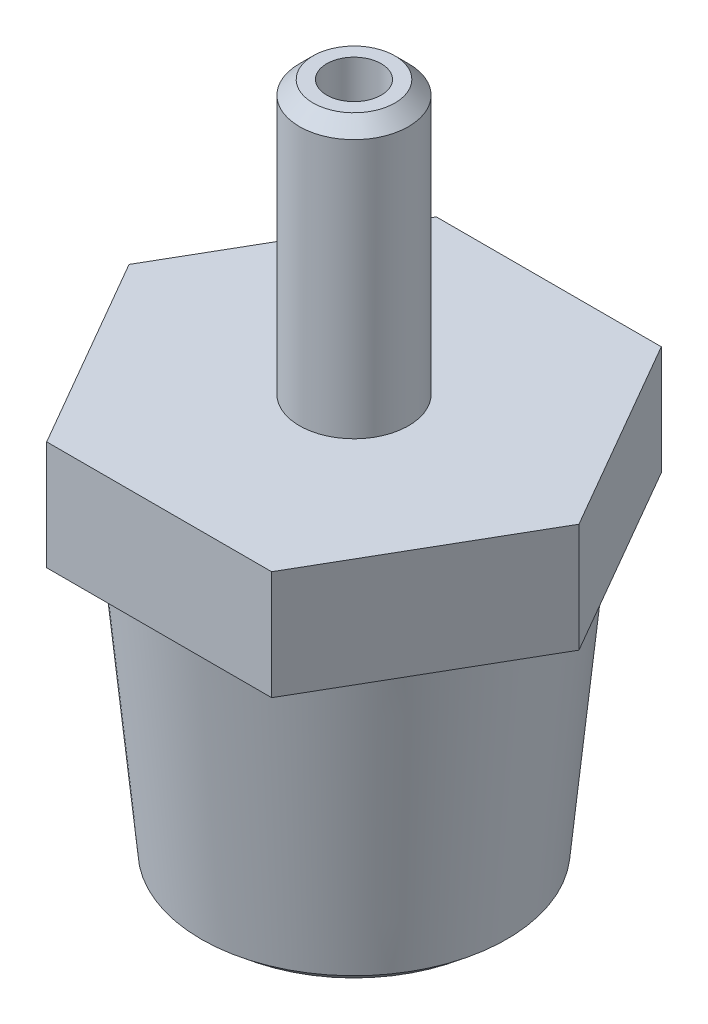
ISO-10303-21;
HEADER;
FILE_DESCRIPTION(('STEP AP214'),'2;1');
FILE_NAME('part.step','',(''),(''),'','','');
FILE_SCHEMA(('AUTOMOTIVE_DESIGN { 1 0 10303 214 1 1 1 1 }'));
ENDSEC;
DATA;
#1=APPLICATION_CONTEXT('core data for automotive mechanical design processes');
#2=APPLICATION_PROTOCOL_DEFINITION('international standard','automotive_design',2000,#1);
#3=PRODUCT_CONTEXT('',#1,'mechanical');
#4=PRODUCT('Part','Part','',(#3));
#5=PRODUCT_RELATED_PRODUCT_CATEGORY('part','',(#4));
#6=PRODUCT_DEFINITION_FORMATION('','',#4);
#7=PRODUCT_DEFINITION_CONTEXT('part definition',#1,'design');
#8=PRODUCT_DEFINITION('design','',#6,#7);
#9=PRODUCT_DEFINITION_SHAPE('','',#8);
#10=(LENGTH_UNIT() NAMED_UNIT(*) SI_UNIT(.MILLI.,.METRE.));
#11=(NAMED_UNIT(*) PLANE_ANGLE_UNIT() SI_UNIT($,.RADIAN.));
#12=(NAMED_UNIT(*) SI_UNIT($,.STERADIAN.) SOLID_ANGLE_UNIT());
#13=UNCERTAINTY_MEASURE_WITH_UNIT(LENGTH_MEASURE(1.E-05),#10,'distance_accuracy_value','');
#14=(GEOMETRIC_REPRESENTATION_CONTEXT(3) GLOBAL_UNCERTAINTY_ASSIGNED_CONTEXT((#13)) GLOBAL_UNIT_ASSIGNED_CONTEXT((#10,
#11,#12)) REPRESENTATION_CONTEXT('',''));
#15=CARTESIAN_POINT('',(0.,0.,0.));
#16=DIRECTION('',(0.,0.,1.));
#17=DIRECTION('',(1.,0.,0.));
#18=AXIS2_PLACEMENT_3D('',#15,#16,#17);
#19=CARTESIAN_POINT('',(0.,0.,0.));
#20=DIRECTION('',(0.,-1.,0.));
#21=DIRECTION('',(0.,0.,-1.));
#22=AXIS2_PLACEMENT_3D('',#19,#20,#21);
#23=CYLINDRICAL_SURFACE('',#22,1.);
#24=CARTESIAN_POINT('',(0.,25.,0.));
#25=DIRECTION('',(0.,-1.,0.));
#26=DIRECTION('',(0.,0.,-1.));
#27=AXIS2_PLACEMENT_3D('',#24,#25,#26);
#28=CIRCLE('',#27,1.);
#29=CARTESIAN_POINT('',(0.,25.,-1.));
#30=VERTEX_POINT('',#29);
#31=EDGE_CURVE('E158',#30,#30,#28,.T.);
#32=ORIENTED_EDGE('',*,*,#31,.F.);
#33=EDGE_LOOP('',(#32));
#34=FACE_BOUND('',#33,.T.);
#35=CARTESIAN_POINT('',(0.,11.,0.));
#36=DIRECTION('',(0.,1.,0.));
#37=DIRECTION('',(0.,0.,1.));
#38=AXIS2_PLACEMENT_3D('',#35,#36,#37);
#39=CIRCLE('',#38,1.);
#40=CARTESIAN_POINT('',(0.,11.,1.));
#41=VERTEX_POINT('',#40);
#42=EDGE_CURVE('E129',#41,#41,#39,.T.);
#43=ORIENTED_EDGE('',*,*,#42,.F.);
#44=EDGE_LOOP('',(#43));
#45=FACE_BOUND('',#44,.T.);
#46=ADVANCED_FACE('F35',(#34,#45),#23,.F.);
#47=CARTESIAN_POINT('',(1.,25.,0.));
#48=DIRECTION('',(0.,1.,0.));
#49=DIRECTION('',(0.,0.,1.));
#50=AXIS2_PLACEMENT_3D('',#47,#48,#49);
#51=PLANE('',#50);
#52=CARTESIAN_POINT('',(0.,25.,0.));
#53=DIRECTION('',(0.,1.,0.));
#54=DIRECTION('',(0.,0.,1.));
#55=AXIS2_PLACEMENT_3D('',#52,#53,#54);
#56=CIRCLE('',#55,1.49999999999999);
#57=CARTESIAN_POINT('',(0.,25.,1.49999999999999));
#58=VERTEX_POINT('',#57);
#59=EDGE_CURVE('E11',#58,#58,#56,.T.);
#60=ORIENTED_EDGE('',*,*,#59,.T.);
#61=EDGE_LOOP('',(#60));
#62=FACE_BOUND('',#61,.T.);
#63=ORIENTED_EDGE('',*,*,#31,.T.);
#64=EDGE_LOOP('',(#63));
#65=FACE_BOUND('',#64,.T.);
#66=ADVANCED_FACE('F184',(#62,#65),#51,.T.);
#67=CARTESIAN_POINT('',(0.,0.,0.));
#68=DIRECTION('',(0.,-1.,0.));
#69=DIRECTION('',(0.,0.,-1.));
#70=AXIS2_PLACEMENT_3D('',#67,#68,#69);
#71=CYLINDRICAL_SURFACE('',#70,2.);
#72=CARTESIAN_POINT('',(0.,24.5,0.));
#73=DIRECTION('',(0.,1.,0.));
#74=DIRECTION('',(0.,0.,1.));
#75=AXIS2_PLACEMENT_3D('',#72,#73,#74);
#76=CIRCLE('',#75,2.);
#77=CARTESIAN_POINT('',(0.,24.5,2.));
#78=VERTEX_POINT('',#77);
#79=EDGE_CURVE('E45',#78,#78,#76,.F.);
#80=ORIENTED_EDGE('',*,*,#79,.T.);
#81=EDGE_LOOP('',(#80));
#82=FACE_BOUND('',#81,.T.);
#83=CARTESIAN_POINT('',(0.,15.,0.));
#84=DIRECTION('',(0.,-1.,0.));
#85=DIRECTION('',(0.,0.,-1.));
#86=AXIS2_PLACEMENT_3D('',#83,#84,#85);
#87=CIRCLE('',#86,2.);
#88=CARTESIAN_POINT('',(0.,15.,-2.));
#89=VERTEX_POINT('',#88);
#90=EDGE_CURVE('E155',#89,#89,#87,.T.);
#91=ORIENTED_EDGE('',*,*,#90,.F.);
#92=EDGE_LOOP('',(#91));
#93=FACE_BOUND('',#92,.T.);
#94=ADVANCED_FACE('F171',(#82,#93),#71,.T.);
#95=CARTESIAN_POINT('',(2.,15.,0.));
#96=DIRECTION('',(0.,1.,0.));
#97=DIRECTION('',(0.,0.,1.));
#98=AXIS2_PLACEMENT_3D('',#95,#96,#97);
#99=PLANE('',#98);
#100=ORIENTED_EDGE('',*,*,#90,.T.);
#101=EDGE_LOOP('',(#100));
#102=FACE_BOUND('',#101,.T.);
#103=DIRECTION('',(-0.5,0.,0.866025403784439));
#104=VECTOR('',#103,1.);
#105=CARTESIAN_POINT('',(-4.12444598552339,15.,-7.14375));
#106=LINE('',#105,#104);
#107=CARTESIAN_POINT('',(-4.12444598552339,15.,-7.14375));
#108=VERTEX_POINT('',#107);
#109=CARTESIAN_POINT('',(-8.24889197104678,15.,0.));
#110=VERTEX_POINT('',#109);
#111=EDGE_CURVE('E125',#108,#110,#106,.T.);
#112=ORIENTED_EDGE('',*,*,#111,.T.);
#113=DIRECTION('',(0.5,0.,0.866025403784439));
#114=VECTOR('',#113,1.);
#115=CARTESIAN_POINT('',(-8.24889197104678,15.,0.));
#116=LINE('',#115,#114);
#117=CARTESIAN_POINT('',(-4.12444598552339,15.,7.14375));
#118=VERTEX_POINT('',#117);
#119=EDGE_CURVE('E128',#110,#118,#116,.T.);
#120=ORIENTED_EDGE('',*,*,#119,.T.);
#121=DIRECTION('',(1.,0.,0.));
#122=VECTOR('',#121,1.);
#123=CARTESIAN_POINT('',(-4.12444598552339,15.,7.14375));
#124=LINE('',#123,#122);
#125=CARTESIAN_POINT('',(4.12444598552339,15.,7.14375));
#126=VERTEX_POINT('',#125);
#127=EDGE_CURVE('E132',#118,#126,#124,.T.);
#128=ORIENTED_EDGE('',*,*,#127,.T.);
#129=DIRECTION('',(0.5,0.,-0.866025403784439));
#130=VECTOR('',#129,1.);
#131=CARTESIAN_POINT('',(4.12444598552339,15.,7.14375));
#132=LINE('',#131,#130);
#133=CARTESIAN_POINT('',(8.24889197104678,15.,0.));
#134=VERTEX_POINT('',#133);
#135=EDGE_CURVE('E135',#126,#134,#132,.T.);
#136=ORIENTED_EDGE('',*,*,#135,.T.);
#137=DIRECTION('',(-0.5,0.,-0.866025403784439));
#138=VECTOR('',#137,1.);
#139=CARTESIAN_POINT('',(8.24889197104678,15.,0.));
#140=LINE('',#139,#138);
#141=CARTESIAN_POINT('',(4.12444598552339,15.,-7.14375));
#142=VERTEX_POINT('',#141);
#143=EDGE_CURVE('E101',#134,#142,#140,.T.);
#144=ORIENTED_EDGE('',*,*,#143,.T.);
#145=DIRECTION('',(-1.,0.,0.));
#146=VECTOR('',#145,1.);
#147=CARTESIAN_POINT('',(4.12444598552339,15.,-7.14375));
#148=LINE('',#147,#146);
#149=EDGE_CURVE('E138',#142,#108,#148,.T.);
#150=ORIENTED_EDGE('',*,*,#149,.T.);
#151=EDGE_LOOP('',(#112,#120,#128,#136,#144,#150));
#152=FACE_BOUND('',#151,.T.);
#153=ADVANCED_FACE('F202',(#102,#152),#99,.T.);
#154=CARTESIAN_POINT('',(0.,11.,0.));
#155=DIRECTION('',(0.,1.,0.));
#156=DIRECTION('',(0.,0.,1.));
#157=AXIS2_PLACEMENT_3D('',#154,#155,#156);
#158=PLANE('',#157);
#159=ORIENTED_EDGE('',*,*,#42,.T.);
#160=EDGE_LOOP('',(#159));
#161=FACE_BOUND('',#160,.T.);
#162=CARTESIAN_POINT('',(0.,11.,0.));
#163=DIRECTION('',(0.,1.,0.));
#164=DIRECTION('',(0.,0.,1.));
#165=AXIS2_PLACEMENT_3D('',#162,#163,#164);
#166=CIRCLE('',#165,3.55625);
#167=CARTESIAN_POINT('',(0.,11.,3.55625));
#168=VERTEX_POINT('',#167);
#169=EDGE_CURVE('E143',#168,#168,#166,.T.);
#170=ORIENTED_EDGE('',*,*,#169,.F.);
#171=EDGE_LOOP('',(#170));
#172=FACE_BOUND('',#171,.T.);
#173=ADVANCED_FACE('F205',(#161,#172),#158,.F.);
#174=CARTESIAN_POINT('',(0.,0.,0.));
#175=DIRECTION('',(0.,1.,0.));
#176=DIRECTION('',(0.,0.,1.));
#177=AXIS2_PLACEMENT_3D('',#174,#175,#176);
#178=CONICAL_SURFACE('',#177,5.55625,0.0959544192307205);
#179=CARTESIAN_POINT('',(0.,0.497699952929385,0.));
#180=DIRECTION('',(0.,-1.,0.));
#181=DIRECTION('',(0.,0.,-1.));
#182=AXIS2_PLACEMENT_3D('',#179,#180,#181);
#183=CIRCLE('',#182,5.60415362046945);
#184=CARTESIAN_POINT('',(0.,0.497699952929385,-5.60415362046945));
#185=VERTEX_POINT('',#184);
#186=EDGE_CURVE('E166',#185,#185,#183,.F.);
#187=ORIENTED_EDGE('',*,*,#186,.T.);
#188=EDGE_LOOP('',(#187));
#189=FACE_BOUND('',#188,.T.);
#190=CARTESIAN_POINT('',(0.,11.,0.));
#191=DIRECTION('',(0.,1.,0.));
#192=DIRECTION('',(0.,0.,1.));
#193=AXIS2_PLACEMENT_3D('',#190,#191,#192);
#194=CIRCLE('',#193,6.615);
#195=CARTESIAN_POINT('',(0.,11.,6.615));
#196=VERTEX_POINT('',#195);
#197=EDGE_CURVE('E149',#196,#196,#194,.F.);
#198=ORIENTED_EDGE('',*,*,#197,.T.);
#199=EDGE_LOOP('',(#198));
#200=FACE_BOUND('',#199,.T.);
#201=ADVANCED_FACE('F207',(#189,#200),#178,.T.);
#202=CARTESIAN_POINT('',(5.55625,0.,0.));
#203=DIRECTION('',(0.,-1.,0.));
#204=DIRECTION('',(0.,0.,-1.));
#205=AXIS2_PLACEMENT_3D('',#202,#203,#204);
#206=PLANE('',#205);
#207=CARTESIAN_POINT('',(0.,0.,0.));
#208=DIRECTION('',(0.,-1.,0.));
#209=DIRECTION('',(0.,0.,-1.));
#210=AXIS2_PLACEMENT_3D('',#207,#208,#209);
#211=CIRCLE('',#210,5.00044288918443);
#212=CARTESIAN_POINT('',(0.,0.,-5.00044288918443));
#213=VERTEX_POINT('',#212);
#214=EDGE_CURVE('E161',#213,#213,#211,.T.);
#215=ORIENTED_EDGE('',*,*,#214,.T.);
#216=EDGE_LOOP('',(#215));
#217=FACE_BOUND('',#216,.T.);
#218=CARTESIAN_POINT('',(0.,0.,0.));
#219=DIRECTION('',(0.,-1.,0.));
#220=DIRECTION('',(0.,0.,-1.));
#221=AXIS2_PLACEMENT_3D('',#218,#219,#220);
#222=CIRCLE('',#221,3.55625);
#223=CARTESIAN_POINT('',(0.,0.,-3.55625));
#224=VERTEX_POINT('',#223);
#225=EDGE_CURVE('E152',#224,#224,#222,.T.);
#226=ORIENTED_EDGE('',*,*,#225,.F.);
#227=EDGE_LOOP('',(#226));
#228=FACE_BOUND('',#227,.T.);
#229=ADVANCED_FACE('F210',(#217,#228),#206,.T.);
#230=CARTESIAN_POINT('',(0.,0.,0.));
#231=DIRECTION('',(0.,-1.,0.));
#232=DIRECTION('',(0.,0.,-1.));
#233=AXIS2_PLACEMENT_3D('',#230,#231,#232);
#234=CYLINDRICAL_SURFACE('',#233,3.55625);
#235=ORIENTED_EDGE('',*,*,#225,.T.);
#236=EDGE_LOOP('',(#235));
#237=FACE_BOUND('',#236,.T.);
#238=ORIENTED_EDGE('',*,*,#169,.T.);
#239=EDGE_LOOP('',(#238));
#240=FACE_BOUND('',#239,.T.);
#241=ADVANCED_FACE('F214',(#237,#240),#234,.F.);
#242=DIRECTION('',(-0.5,0.,0.866025403784439));
#243=VECTOR('',#242,1.);
#244=CARTESIAN_POINT('',(-4.12444598552339,11.,-7.14375));
#245=LINE('',#244,#243);
#246=CARTESIAN_POINT('',(-4.12444598552339,11.,-7.14375));
#247=VERTEX_POINT('',#246);
#248=CARTESIAN_POINT('',(-8.24889197104678,11.,0.));
#249=VERTEX_POINT('',#248);
#250=EDGE_CURVE('E141',#247,#249,#245,.T.);
#251=ORIENTED_EDGE('',*,*,#250,.F.);
#252=DIRECTION('',(-1.,0.,0.));
#253=VECTOR('',#252,1.);
#254=CARTESIAN_POINT('',(4.12444598552339,11.,-7.14375));
#255=LINE('',#254,#253);
#256=CARTESIAN_POINT('',(4.12444598552339,11.,-7.14375));
#257=VERTEX_POINT('',#256);
#258=EDGE_CURVE('E115',#257,#247,#255,.T.);
#259=ORIENTED_EDGE('',*,*,#258,.F.);
#260=DIRECTION('',(-0.5,0.,-0.866025403784439));
#261=VECTOR('',#260,1.);
#262=CARTESIAN_POINT('',(8.24889197104678,11.,0.));
#263=LINE('',#262,#261);
#264=CARTESIAN_POINT('',(8.24889197104678,11.,0.));
#265=VERTEX_POINT('',#264);
#266=EDGE_CURVE('E99',#265,#257,#263,.T.);
#267=ORIENTED_EDGE('',*,*,#266,.F.);
#268=DIRECTION('',(0.5,0.,-0.866025403784439));
#269=VECTOR('',#268,1.);
#270=CARTESIAN_POINT('',(4.12444598552339,11.,7.14375));
#271=LINE('',#270,#269);
#272=CARTESIAN_POINT('',(4.12444598552339,11.,7.14375));
#273=VERTEX_POINT('',#272);
#274=EDGE_CURVE('E113',#273,#265,#271,.T.);
#275=ORIENTED_EDGE('',*,*,#274,.F.);
#276=DIRECTION('',(1.,0.,0.));
#277=VECTOR('',#276,1.);
#278=CARTESIAN_POINT('',(-4.12444598552339,11.,7.14375));
#279=LINE('',#278,#277);
#280=CARTESIAN_POINT('',(-4.12444598552339,11.,7.14375));
#281=VERTEX_POINT('',#280);
#282=EDGE_CURVE('E118',#281,#273,#279,.T.);
#283=ORIENTED_EDGE('',*,*,#282,.F.);
#284=DIRECTION('',(0.5,0.,0.866025403784439));
#285=VECTOR('',#284,1.);
#286=CARTESIAN_POINT('',(-8.24889197104678,11.,0.));
#287=LINE('',#286,#285);
#288=EDGE_CURVE('E120',#249,#281,#287,.T.);
#289=ORIENTED_EDGE('',*,*,#288,.F.);
#290=EDGE_LOOP('',(#251,#259,#267,#275,#283,#289));
#291=FACE_BOUND('',#290,.T.);
#292=ORIENTED_EDGE('',*,*,#197,.F.);
#293=EDGE_LOOP('',(#292));
#294=FACE_BOUND('',#293,.T.);
#295=ADVANCED_FACE('F110',(#291,#294),#158,.F.);
#296=CARTESIAN_POINT('',(-4.12444598552339,11.,-7.14375));
#297=DIRECTION('',(-0.866025403784439,0.,-0.5));
#298=DIRECTION('',(-0.5,0.,0.866025403784439));
#299=AXIS2_PLACEMENT_3D('',#296,#297,#298);
#300=PLANE('',#299);
#301=ORIENTED_EDGE('',*,*,#111,.F.);
#302=DIRECTION('',(0.,1.,0.));
#303=VECTOR('',#302,1.);
#304=CARTESIAN_POINT('',(-4.12444598552339,11.,-7.14375));
#305=LINE('',#304,#303);
#306=EDGE_CURVE('E53',#247,#108,#305,.T.);
#307=ORIENTED_EDGE('',*,*,#306,.F.);
#308=ORIENTED_EDGE('',*,*,#250,.T.);
#309=DIRECTION('',(0.,1.,0.));
#310=VECTOR('',#309,1.);
#311=CARTESIAN_POINT('',(-8.24889197104678,11.,0.));
#312=LINE('',#311,#310);
#313=EDGE_CURVE('E88',#249,#110,#312,.T.);
#314=ORIENTED_EDGE('',*,*,#313,.T.);
#315=EDGE_LOOP('',(#301,#307,#308,#314));
#316=FACE_BOUND('',#315,.T.);
#317=ADVANCED_FACE('F219',(#316),#300,.T.);
#318=CARTESIAN_POINT('',(4.12444598552339,11.,-7.14375));
#319=DIRECTION('',(0.,0.,-1.));
#320=DIRECTION('',(-1.,0.,0.));
#321=AXIS2_PLACEMENT_3D('',#318,#319,#320);
#322=PLANE('',#321);
#323=ORIENTED_EDGE('',*,*,#149,.F.);
#324=DIRECTION('',(0.,1.,0.));
#325=VECTOR('',#324,1.);
#326=CARTESIAN_POINT('',(4.12444598552339,11.,-7.14375));
#327=LINE('',#326,#325);
#328=EDGE_CURVE('E76',#257,#142,#327,.T.);
#329=ORIENTED_EDGE('',*,*,#328,.F.);
#330=ORIENTED_EDGE('',*,*,#258,.T.);
#331=ORIENTED_EDGE('',*,*,#306,.T.);
#332=EDGE_LOOP('',(#323,#329,#330,#331));
#333=FACE_BOUND('',#332,.T.);
#334=ADVANCED_FACE('F222',(#333),#322,.T.);
#335=CARTESIAN_POINT('',(8.24889197104678,11.,0.));
#336=DIRECTION('',(0.866025403784439,0.,-0.5));
#337=DIRECTION('',(-0.5,0.,-0.866025403784439));
#338=AXIS2_PLACEMENT_3D('',#335,#336,#337);
#339=PLANE('',#338);
#340=ORIENTED_EDGE('',*,*,#143,.F.);
#341=DIRECTION('',(0.,1.,0.));
#342=VECTOR('',#341,1.);
#343=CARTESIAN_POINT('',(8.24889197104678,11.,0.));
#344=LINE('',#343,#342);
#345=EDGE_CURVE('E96',#265,#134,#344,.T.);
#346=ORIENTED_EDGE('',*,*,#345,.F.);
#347=ORIENTED_EDGE('',*,*,#266,.T.);
#348=ORIENTED_EDGE('',*,*,#328,.T.);
#349=EDGE_LOOP('',(#340,#346,#347,#348));
#350=FACE_BOUND('',#349,.T.);
#351=ADVANCED_FACE('F98',(#350),#339,.T.);
#352=CARTESIAN_POINT('',(4.12444598552339,11.,7.14375));
#353=DIRECTION('',(0.866025403784439,0.,0.5));
#354=DIRECTION('',(0.5,0.,-0.866025403784439));
#355=AXIS2_PLACEMENT_3D('',#352,#353,#354);
#356=PLANE('',#355);
#357=ORIENTED_EDGE('',*,*,#135,.F.);
#358=DIRECTION('',(0.,1.,0.));
#359=VECTOR('',#358,1.);
#360=CARTESIAN_POINT('',(4.12444598552339,11.,7.14375));
#361=LINE('',#360,#359);
#362=EDGE_CURVE('E106',#273,#126,#361,.T.);
#363=ORIENTED_EDGE('',*,*,#362,.F.);
#364=ORIENTED_EDGE('',*,*,#274,.T.);
#365=ORIENTED_EDGE('',*,*,#345,.T.);
#366=EDGE_LOOP('',(#357,#363,#364,#365));
#367=FACE_BOUND('',#366,.T.);
#368=ADVANCED_FACE('F117',(#367),#356,.T.);
#369=CARTESIAN_POINT('',(-4.12444598552339,11.,7.14375));
#370=DIRECTION('',(0.,0.,1.));
#371=DIRECTION('',(1.,0.,0.));
#372=AXIS2_PLACEMENT_3D('',#369,#370,#371);
#373=PLANE('',#372);
#374=ORIENTED_EDGE('',*,*,#127,.F.);
#375=DIRECTION('',(0.,1.,0.));
#376=VECTOR('',#375,1.);
#377=CARTESIAN_POINT('',(-4.12444598552339,11.,7.14375));
#378=LINE('',#377,#376);
#379=EDGE_CURVE('E146',#281,#118,#378,.T.);
#380=ORIENTED_EDGE('',*,*,#379,.F.);
#381=ORIENTED_EDGE('',*,*,#282,.T.);
#382=ORIENTED_EDGE('',*,*,#362,.T.);
#383=EDGE_LOOP('',(#374,#380,#381,#382));
#384=FACE_BOUND('',#383,.T.);
#385=ADVANCED_FACE('F225',(#384),#373,.T.);
#386=CARTESIAN_POINT('',(-8.24889197104678,11.,0.));
#387=DIRECTION('',(-0.866025403784439,0.,0.5));
#388=DIRECTION('',(0.5,0.,0.866025403784439));
#389=AXIS2_PLACEMENT_3D('',#386,#387,#388);
#390=PLANE('',#389);
#391=ORIENTED_EDGE('',*,*,#119,.F.);
#392=ORIENTED_EDGE('',*,*,#313,.F.);
#393=ORIENTED_EDGE('',*,*,#288,.T.);
#394=ORIENTED_EDGE('',*,*,#379,.T.);
#395=EDGE_LOOP('',(#391,#392,#393,#394));
#396=FACE_BOUND('',#395,.T.);
#397=ADVANCED_FACE('F180',(#396),#390,.T.);
#398=CARTESIAN_POINT('',(0.,0.,0.));
#399=DIRECTION('',(0.,1.,0.));
#400=DIRECTION('',(0.,0.,1.));
#401=AXIS2_PLACEMENT_3D('',#398,#399,#400);
#402=CONICAL_SURFACE('',#401,5.00044288918443,0.881352582628171);
#403=ORIENTED_EDGE('',*,*,#186,.F.);
#404=EDGE_LOOP('',(#403));
#405=FACE_BOUND('',#404,.T.);
#406=ORIENTED_EDGE('',*,*,#214,.F.);
#407=EDGE_LOOP('',(#406));
#408=FACE_BOUND('',#407,.T.);
#409=ADVANCED_FACE('F175',(#405,#408),#402,.T.);
#410=CARTESIAN_POINT('',(0.,24.5,0.));
#411=DIRECTION('',(0.,-1.,0.));
#412=DIRECTION('',(0.,0.,-1.));
#413=AXIS2_PLACEMENT_3D('',#410,#411,#412);
#414=CONICAL_SURFACE('',#413,2.,0.785398163397451);
#415=ORIENTED_EDGE('',*,*,#59,.F.);
#416=EDGE_LOOP('',(#415));
#417=FACE_BOUND('',#416,.T.);
#418=ORIENTED_EDGE('',*,*,#79,.F.);
#419=EDGE_LOOP('',(#418));
#420=FACE_BOUND('',#419,.T.);
#421=ADVANCED_FACE('F38',(#417,#420),#414,.T.);
#422=CLOSED_SHELL('',(#46,#66,#94,#153,#173,#201,#229,#241,#295,#317,#334,#351,#368,#385,#397,
#409,#421));
#423=MANIFOLD_SOLID_BREP('B2',#422);
#424=ADVANCED_BREP_SHAPE_REPRESENTATION('',(#18,#423),#14);
#425=SHAPE_DEFINITION_REPRESENTATION(#9,#424);
ENDSEC;
END-ISO-10303-21;
